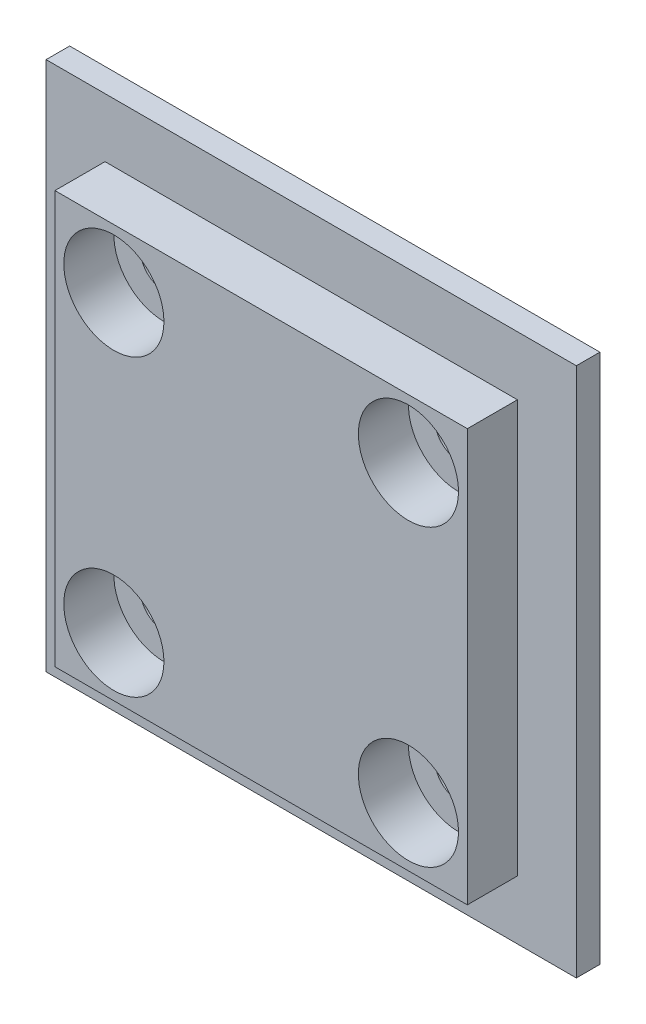
ISO-10303-21;
HEADER;
FILE_DESCRIPTION(('STEP AP214'),'2;1');
FILE_NAME('part.step','',(''),(''),'','','');
FILE_SCHEMA(('AUTOMOTIVE_DESIGN { 1 0 10303 214 1 1 1 1 }'));
ENDSEC;
DATA;
#1=APPLICATION_CONTEXT('core data for automotive mechanical design processes');
#2=APPLICATION_PROTOCOL_DEFINITION('international standard','automotive_design',2000,#1);
#3=PRODUCT_CONTEXT('',#1,'mechanical');
#4=PRODUCT('Part','Part','',(#3));
#5=PRODUCT_RELATED_PRODUCT_CATEGORY('part','',(#4));
#6=PRODUCT_DEFINITION_FORMATION('','',#4);
#7=PRODUCT_DEFINITION_CONTEXT('part definition',#1,'design');
#8=PRODUCT_DEFINITION('design','',#6,#7);
#9=PRODUCT_DEFINITION_SHAPE('','',#8);
#10=(LENGTH_UNIT() NAMED_UNIT(*) SI_UNIT(.MILLI.,.METRE.));
#11=(NAMED_UNIT(*) PLANE_ANGLE_UNIT() SI_UNIT($,.RADIAN.));
#12=(NAMED_UNIT(*) SI_UNIT($,.STERADIAN.) SOLID_ANGLE_UNIT());
#13=UNCERTAINTY_MEASURE_WITH_UNIT(LENGTH_MEASURE(1.E-05),#10,'distance_accuracy_value','');
#14=(GEOMETRIC_REPRESENTATION_CONTEXT(3) GLOBAL_UNCERTAINTY_ASSIGNED_CONTEXT((#13)) GLOBAL_UNIT_ASSIGNED_CONTEXT((#10,
#11,#12)) REPRESENTATION_CONTEXT('',''));
#15=CARTESIAN_POINT('',(0.,0.,0.));
#16=DIRECTION('',(0.,0.,1.));
#17=DIRECTION('',(1.,0.,0.));
#18=AXIS2_PLACEMENT_3D('',#15,#16,#17);
#19=CARTESIAN_POINT('',(10.,10.,4.));
#20=DIRECTION('',(0.,0.,-1.));
#21=DIRECTION('',(1.,0.,0.));
#22=AXIS2_PLACEMENT_3D('',#19,#20,#21);
#23=CYLINDRICAL_SURFACE('',#22,3.4);
#24=CARTESIAN_POINT('',(10.,10.,5.6));
#25=DIRECTION('',(0.,0.,-1.));
#26=DIRECTION('',(1.,0.,0.));
#27=AXIS2_PLACEMENT_3D('',#24,#25,#26);
#28=CIRCLE('',#27,3.4);
#29=CARTESIAN_POINT('',(13.4,10.,5.6));
#30=VERTEX_POINT('',#29);
#31=EDGE_CURVE('E206',#30,#30,#28,.T.);
#32=ORIENTED_EDGE('',*,*,#31,.T.);
#33=DIRECTION('',(0.,0.,1.));
#34=VECTOR('',#33,1.);
#35=CARTESIAN_POINT('',(13.4,10.,4.));
#36=LINE('',#35,#34);
#37=CARTESIAN_POINT('',(13.4,10.,9.));
#38=VERTEX_POINT('',#37);
#39=EDGE_CURVE('E9',#30,#38,#36,.T.);
#40=ORIENTED_EDGE('',*,*,#39,.T.);
#41=CARTESIAN_POINT('',(10.,10.,9.));
#42=DIRECTION('',(0.,0.,-1.));
#43=DIRECTION('',(1.,0.,0.));
#44=AXIS2_PLACEMENT_3D('',#41,#42,#43);
#45=CIRCLE('',#44,3.4);
#46=EDGE_CURVE('E238',#38,#38,#45,.T.);
#47=ORIENTED_EDGE('',*,*,#46,.F.);
#48=ORIENTED_EDGE('',*,*,#39,.F.);
#49=EDGE_LOOP('',(#32,#40,#47,#48));
#50=FACE_BOUND('',#49,.T.);
#51=ADVANCED_FACE('F15',(#50),#23,.F.);
#52=CARTESIAN_POINT('',(-10.,10.,4.));
#53=DIRECTION('',(0.,0.,-1.));
#54=DIRECTION('',(1.,0.,0.));
#55=AXIS2_PLACEMENT_3D('',#52,#53,#54);
#56=CYLINDRICAL_SURFACE('',#55,3.4);
#57=CARTESIAN_POINT('',(-10.,10.,5.6));
#58=DIRECTION('',(0.,0.,-1.));
#59=DIRECTION('',(1.,0.,0.));
#60=AXIS2_PLACEMENT_3D('',#57,#58,#59);
#61=CIRCLE('',#60,3.4);
#62=CARTESIAN_POINT('',(-6.6,10.,5.6));
#63=VERTEX_POINT('',#62);
#64=EDGE_CURVE('E209',#63,#63,#61,.T.);
#65=ORIENTED_EDGE('',*,*,#64,.T.);
#66=DIRECTION('',(0.,0.,1.));
#67=VECTOR('',#66,1.);
#68=CARTESIAN_POINT('',(-6.6,10.,4.));
#69=LINE('',#68,#67);
#70=CARTESIAN_POINT('',(-6.6,10.,9.));
#71=VERTEX_POINT('',#70);
#72=EDGE_CURVE('E18',#63,#71,#69,.T.);
#73=ORIENTED_EDGE('',*,*,#72,.T.);
#74=CARTESIAN_POINT('',(-10.,10.,9.));
#75=DIRECTION('',(0.,0.,-1.));
#76=DIRECTION('',(1.,0.,0.));
#77=AXIS2_PLACEMENT_3D('',#74,#75,#76);
#78=CIRCLE('',#77,3.4);
#79=EDGE_CURVE('E233',#71,#71,#78,.T.);
#80=ORIENTED_EDGE('',*,*,#79,.F.);
#81=ORIENTED_EDGE('',*,*,#72,.F.);
#82=EDGE_LOOP('',(#65,#73,#80,#81));
#83=FACE_BOUND('',#82,.T.);
#84=ADVANCED_FACE('F436',(#83),#56,.F.);
#85=CARTESIAN_POINT('',(10.,-10.,4.));
#86=DIRECTION('',(0.,0.,-1.));
#87=DIRECTION('',(1.,0.,0.));
#88=AXIS2_PLACEMENT_3D('',#85,#86,#87);
#89=CYLINDRICAL_SURFACE('',#88,3.4);
#90=CARTESIAN_POINT('',(10.,-10.,5.6));
#91=DIRECTION('',(0.,0.,-1.));
#92=DIRECTION('',(1.,0.,0.));
#93=AXIS2_PLACEMENT_3D('',#90,#91,#92);
#94=CIRCLE('',#93,3.4);
#95=CARTESIAN_POINT('',(13.4,-10.,5.6));
#96=VERTEX_POINT('',#95);
#97=EDGE_CURVE('E225',#96,#96,#94,.T.);
#98=ORIENTED_EDGE('',*,*,#97,.T.);
#99=DIRECTION('',(0.,0.,1.));
#100=VECTOR('',#99,1.);
#101=CARTESIAN_POINT('',(13.4,-10.,4.));
#102=LINE('',#101,#100);
#103=CARTESIAN_POINT('',(13.4,-10.,9.));
#104=VERTEX_POINT('',#103);
#105=EDGE_CURVE('E242',#96,#104,#102,.T.);
#106=ORIENTED_EDGE('',*,*,#105,.T.);
#107=CARTESIAN_POINT('',(10.,-10.,9.));
#108=DIRECTION('',(0.,0.,-1.));
#109=DIRECTION('',(1.,0.,0.));
#110=AXIS2_PLACEMENT_3D('',#107,#108,#109);
#111=CIRCLE('',#110,3.4);
#112=EDGE_CURVE('E232',#104,#104,#111,.T.);
#113=ORIENTED_EDGE('',*,*,#112,.F.);
#114=ORIENTED_EDGE('',*,*,#105,.F.);
#115=EDGE_LOOP('',(#98,#106,#113,#114));
#116=FACE_BOUND('',#115,.T.);
#117=ADVANCED_FACE('F430',(#116),#89,.F.);
#118=CARTESIAN_POINT('',(-10.,-10.,4.));
#119=DIRECTION('',(0.,0.,-1.));
#120=DIRECTION('',(1.,0.,0.));
#121=AXIS2_PLACEMENT_3D('',#118,#119,#120);
#122=CYLINDRICAL_SURFACE('',#121,3.4);
#123=CARTESIAN_POINT('',(-10.,-10.,5.6));
#124=DIRECTION('',(0.,0.,-1.));
#125=DIRECTION('',(1.,0.,0.));
#126=AXIS2_PLACEMENT_3D('',#123,#124,#125);
#127=CIRCLE('',#126,3.4);
#128=CARTESIAN_POINT('',(-6.6,-10.,5.6));
#129=VERTEX_POINT('',#128);
#130=EDGE_CURVE('E217',#129,#129,#127,.T.);
#131=ORIENTED_EDGE('',*,*,#130,.T.);
#132=DIRECTION('',(0.,0.,1.));
#133=VECTOR('',#132,1.);
#134=CARTESIAN_POINT('',(-6.6,-10.,4.));
#135=LINE('',#134,#133);
#136=CARTESIAN_POINT('',(-6.6,-10.,9.));
#137=VERTEX_POINT('',#136);
#138=EDGE_CURVE('E241',#129,#137,#135,.T.);
#139=ORIENTED_EDGE('',*,*,#138,.T.);
#140=CARTESIAN_POINT('',(-10.,-10.,9.));
#141=DIRECTION('',(0.,0.,-1.));
#142=DIRECTION('',(1.,0.,0.));
#143=AXIS2_PLACEMENT_3D('',#140,#141,#142);
#144=CIRCLE('',#143,3.4);
#145=EDGE_CURVE('E207',#137,#137,#144,.T.);
#146=ORIENTED_EDGE('',*,*,#145,.F.);
#147=ORIENTED_EDGE('',*,*,#138,.F.);
#148=EDGE_LOOP('',(#131,#139,#146,#147));
#149=FACE_BOUND('',#148,.T.);
#150=ADVANCED_FACE('F416',(#149),#122,.F.);
#151=CARTESIAN_POINT('',(0.,0.,9.));
#152=DIRECTION('',(0.,0.,1.));
#153=DIRECTION('',(1.,0.,0.));
#154=AXIS2_PLACEMENT_3D('',#151,#152,#153);
#155=PLANE('',#154);
#156=ORIENTED_EDGE('',*,*,#46,.T.);
#157=EDGE_LOOP('',(#156));
#158=FACE_BOUND('',#157,.T.);
#159=ORIENTED_EDGE('',*,*,#79,.T.);
#160=EDGE_LOOP('',(#159));
#161=FACE_BOUND('',#160,.T.);
#162=ORIENTED_EDGE('',*,*,#112,.T.);
#163=EDGE_LOOP('',(#162));
#164=FACE_BOUND('',#163,.T.);
#165=ORIENTED_EDGE('',*,*,#145,.T.);
#166=EDGE_LOOP('',(#165));
#167=FACE_BOUND('',#166,.T.);
#168=DIRECTION('',(1.,0.,0.));
#169=VECTOR('',#168,1.);
#170=CARTESIAN_POINT('',(-14.,-14.,9.));
#171=LINE('',#170,#169);
#172=CARTESIAN_POINT('',(-14.,-14.,9.));
#173=VERTEX_POINT('',#172);
#174=CARTESIAN_POINT('',(14.,-14.,9.));
#175=VERTEX_POINT('',#174);
#176=EDGE_CURVE('E196',#173,#175,#171,.T.);
#177=ORIENTED_EDGE('',*,*,#176,.T.);
#178=DIRECTION('',(0.,1.,0.));
#179=VECTOR('',#178,1.);
#180=CARTESIAN_POINT('',(14.,-14.,9.));
#181=LINE('',#180,#179);
#182=CARTESIAN_POINT('',(14.,14.,9.));
#183=VERTEX_POINT('',#182);
#184=EDGE_CURVE('E190',#175,#183,#181,.T.);
#185=ORIENTED_EDGE('',*,*,#184,.T.);
#186=DIRECTION('',(-1.,0.,0.));
#187=VECTOR('',#186,1.);
#188=CARTESIAN_POINT('',(14.,14.,9.));
#189=LINE('',#188,#187);
#190=CARTESIAN_POINT('',(-14.,14.,9.));
#191=VERTEX_POINT('',#190);
#192=EDGE_CURVE('E211',#183,#191,#189,.T.);
#193=ORIENTED_EDGE('',*,*,#192,.T.);
#194=DIRECTION('',(0.,-1.,0.));
#195=VECTOR('',#194,1.);
#196=CARTESIAN_POINT('',(-14.,14.,9.));
#197=LINE('',#196,#195);
#198=EDGE_CURVE('E214',#191,#173,#197,.T.);
#199=ORIENTED_EDGE('',*,*,#198,.T.);
#200=EDGE_LOOP('',(#177,#185,#193,#199));
#201=FACE_BOUND('',#200,.T.);
#202=ADVANCED_FACE('F408',(#158,#161,#164,#167,#201),#155,.T.);
#203=CARTESIAN_POINT('',(0.,0.,5.6));
#204=DIRECTION('',(0.,0.,1.));
#205=DIRECTION('',(1.,0.,0.));
#206=AXIS2_PLACEMENT_3D('',#203,#204,#205);
#207=PLANE('',#206);
#208=CARTESIAN_POINT('',(10.,10.,5.6));
#209=DIRECTION('',(0.,0.,-1.));
#210=DIRECTION('',(1.,0.,0.));
#211=AXIS2_PLACEMENT_3D('',#208,#209,#210);
#212=CIRCLE('',#211,1.6);
#213=CARTESIAN_POINT('',(11.6,10.,5.6));
#214=VERTEX_POINT('',#213);
#215=EDGE_CURVE('E176',#214,#214,#212,.T.);
#216=ORIENTED_EDGE('',*,*,#215,.T.);
#217=EDGE_LOOP('',(#216));
#218=FACE_BOUND('',#217,.T.);
#219=ORIENTED_EDGE('',*,*,#31,.F.);
#220=EDGE_LOOP('',(#219));
#221=FACE_BOUND('',#220,.T.);
#222=ADVANCED_FACE('F405',(#218,#221),#207,.T.);
#223=CARTESIAN_POINT('',(0.,0.,5.6));
#224=DIRECTION('',(0.,0.,1.));
#225=DIRECTION('',(1.,0.,0.));
#226=AXIS2_PLACEMENT_3D('',#223,#224,#225);
#227=PLANE('',#226);
#228=CARTESIAN_POINT('',(-10.,10.,5.6));
#229=DIRECTION('',(0.,0.,-1.));
#230=DIRECTION('',(1.,0.,0.));
#231=AXIS2_PLACEMENT_3D('',#228,#229,#230);
#232=CIRCLE('',#231,1.6);
#233=CARTESIAN_POINT('',(-8.4,10.,5.6));
#234=VERTEX_POINT('',#233);
#235=EDGE_CURVE('E164',#234,#234,#232,.T.);
#236=ORIENTED_EDGE('',*,*,#235,.T.);
#237=EDGE_LOOP('',(#236));
#238=FACE_BOUND('',#237,.T.);
#239=ORIENTED_EDGE('',*,*,#64,.F.);
#240=EDGE_LOOP('',(#239));
#241=FACE_BOUND('',#240,.T.);
#242=ADVANCED_FACE('F167',(#238,#241),#227,.T.);
#243=CARTESIAN_POINT('',(0.,0.,5.6));
#244=DIRECTION('',(0.,0.,1.));
#245=DIRECTION('',(1.,0.,0.));
#246=AXIS2_PLACEMENT_3D('',#243,#244,#245);
#247=PLANE('',#246);
#248=CARTESIAN_POINT('',(10.,-10.,5.6));
#249=DIRECTION('',(0.,0.,-1.));
#250=DIRECTION('',(1.,0.,0.));
#251=AXIS2_PLACEMENT_3D('',#248,#249,#250);
#252=CIRCLE('',#251,1.6);
#253=CARTESIAN_POINT('',(11.6,-10.,5.6));
#254=VERTEX_POINT('',#253);
#255=EDGE_CURVE('E181',#254,#254,#252,.T.);
#256=ORIENTED_EDGE('',*,*,#255,.T.);
#257=EDGE_LOOP('',(#256));
#258=FACE_BOUND('',#257,.T.);
#259=ORIENTED_EDGE('',*,*,#97,.F.);
#260=EDGE_LOOP('',(#259));
#261=FACE_BOUND('',#260,.T.);
#262=ADVANCED_FACE('F316',(#258,#261),#247,.T.);
#263=CARTESIAN_POINT('',(0.,0.,5.6));
#264=DIRECTION('',(0.,0.,1.));
#265=DIRECTION('',(1.,0.,0.));
#266=AXIS2_PLACEMENT_3D('',#263,#264,#265);
#267=PLANE('',#266);
#268=CARTESIAN_POINT('',(-10.,-10.,5.6));
#269=DIRECTION('',(0.,0.,-1.));
#270=DIRECTION('',(1.,0.,0.));
#271=AXIS2_PLACEMENT_3D('',#268,#269,#270);
#272=CIRCLE('',#271,1.6);
#273=CARTESIAN_POINT('',(-8.4,-10.,5.6));
#274=VERTEX_POINT('',#273);
#275=EDGE_CURVE('E507',#274,#274,#272,.T.);
#276=ORIENTED_EDGE('',*,*,#275,.T.);
#277=EDGE_LOOP('',(#276));
#278=FACE_BOUND('',#277,.T.);
#279=ORIENTED_EDGE('',*,*,#130,.F.);
#280=EDGE_LOOP('',(#279));
#281=FACE_BOUND('',#280,.T.);
#282=ADVANCED_FACE('F283',(#278,#281),#267,.T.);
#283=CARTESIAN_POINT('',(-14.,14.,5.6));
#284=DIRECTION('',(1.,0.,0.));
#285=DIRECTION('',(0.,1.,0.));
#286=AXIS2_PLACEMENT_3D('',#283,#284,#285);
#287=PLANE('',#286);
#288=DIRECTION('',(0.,-1.,0.));
#289=VECTOR('',#288,1.);
#290=CARTESIAN_POINT('',(-14.,14.,5.6));
#291=LINE('',#290,#289);
#292=CARTESIAN_POINT('',(-14.,14.,5.6));
#293=VERTEX_POINT('',#292);
#294=CARTESIAN_POINT('',(-14.,-14.,5.6));
#295=VERTEX_POINT('',#294);
#296=EDGE_CURVE('E506',#293,#295,#291,.T.);
#297=ORIENTED_EDGE('',*,*,#296,.T.);
#298=DIRECTION('',(0.,0.,1.));
#299=VECTOR('',#298,1.);
#300=CARTESIAN_POINT('',(-14.,-14.,5.6));
#301=LINE('',#300,#299);
#302=EDGE_CURVE('E205',#295,#173,#301,.T.);
#303=ORIENTED_EDGE('',*,*,#302,.T.);
#304=ORIENTED_EDGE('',*,*,#198,.F.);
#305=DIRECTION('',(0.,0.,1.));
#306=VECTOR('',#305,1.);
#307=CARTESIAN_POINT('',(-14.,14.,5.6));
#308=LINE('',#307,#306);
#309=EDGE_CURVE('E188',#293,#191,#308,.T.);
#310=ORIENTED_EDGE('',*,*,#309,.F.);
#311=EDGE_LOOP('',(#297,#303,#304,#310));
#312=FACE_BOUND('',#311,.T.);
#313=ADVANCED_FACE('F279',(#312),#287,.F.);
#314=CARTESIAN_POINT('',(14.,14.,5.6));
#315=DIRECTION('',(0.,-1.,0.));
#316=DIRECTION('',(0.,0.,-1.));
#317=AXIS2_PLACEMENT_3D('',#314,#315,#316);
#318=PLANE('',#317);
#319=DIRECTION('',(-1.,0.,0.));
#320=VECTOR('',#319,1.);
#321=CARTESIAN_POINT('',(14.,14.,5.6));
#322=LINE('',#321,#320);
#323=CARTESIAN_POINT('',(14.,14.,5.6));
#324=VERTEX_POINT('',#323);
#325=EDGE_CURVE('E500',#324,#293,#322,.T.);
#326=ORIENTED_EDGE('',*,*,#325,.T.);
#327=ORIENTED_EDGE('',*,*,#309,.T.);
#328=ORIENTED_EDGE('',*,*,#192,.F.);
#329=DIRECTION('',(0.,0.,1.));
#330=VECTOR('',#329,1.);
#331=CARTESIAN_POINT('',(14.,14.,5.6));
#332=LINE('',#331,#330);
#333=EDGE_CURVE('E189',#324,#183,#332,.T.);
#334=ORIENTED_EDGE('',*,*,#333,.F.);
#335=EDGE_LOOP('',(#326,#327,#328,#334));
#336=FACE_BOUND('',#335,.T.);
#337=ADVANCED_FACE('F284',(#336),#318,.F.);
#338=CARTESIAN_POINT('',(14.,-14.,5.6));
#339=DIRECTION('',(-1.,0.,0.));
#340=DIRECTION('',(0.,0.,1.));
#341=AXIS2_PLACEMENT_3D('',#338,#339,#340);
#342=PLANE('',#341);
#343=DIRECTION('',(0.,1.,0.));
#344=VECTOR('',#343,1.);
#345=CARTESIAN_POINT('',(14.,-14.,5.6));
#346=LINE('',#345,#344);
#347=CARTESIAN_POINT('',(14.,-14.,5.6));
#348=VERTEX_POINT('',#347);
#349=EDGE_CURVE('E495',#348,#324,#346,.T.);
#350=ORIENTED_EDGE('',*,*,#349,.T.);
#351=ORIENTED_EDGE('',*,*,#333,.T.);
#352=ORIENTED_EDGE('',*,*,#184,.F.);
#353=DIRECTION('',(0.,0.,1.));
#354=VECTOR('',#353,1.);
#355=CARTESIAN_POINT('',(14.,-14.,5.6));
#356=LINE('',#355,#354);
#357=EDGE_CURVE('E192',#348,#175,#356,.T.);
#358=ORIENTED_EDGE('',*,*,#357,.F.);
#359=EDGE_LOOP('',(#350,#351,#352,#358));
#360=FACE_BOUND('',#359,.T.);
#361=ADVANCED_FACE('F378',(#360),#342,.F.);
#362=CARTESIAN_POINT('',(-14.,-14.,5.6));
#363=DIRECTION('',(0.,1.,0.));
#364=DIRECTION('',(1.,0.,0.));
#365=AXIS2_PLACEMENT_3D('',#362,#363,#364);
#366=PLANE('',#365);
#367=DIRECTION('',(1.,0.,0.));
#368=VECTOR('',#367,1.);
#369=CARTESIAN_POINT('',(-14.,-14.,5.6));
#370=LINE('',#369,#368);
#371=EDGE_CURVE('E487',#295,#348,#370,.T.);
#372=ORIENTED_EDGE('',*,*,#371,.T.);
#373=ORIENTED_EDGE('',*,*,#357,.T.);
#374=ORIENTED_EDGE('',*,*,#176,.F.);
#375=ORIENTED_EDGE('',*,*,#302,.F.);
#376=EDGE_LOOP('',(#372,#373,#374,#375));
#377=FACE_BOUND('',#376,.T.);
#378=ADVANCED_FACE('F369',(#377),#366,.F.);
#379=CARTESIAN_POINT('',(10.,10.,3.));
#380=DIRECTION('',(0.,0.,-1.));
#381=DIRECTION('',(1.,0.,0.));
#382=AXIS2_PLACEMENT_3D('',#379,#380,#381);
#383=CYLINDRICAL_SURFACE('',#382,1.6);
#384=CARTESIAN_POINT('',(10.,10.,4.));
#385=DIRECTION('',(0.,0.,-1.));
#386=DIRECTION('',(1.,0.,0.));
#387=AXIS2_PLACEMENT_3D('',#384,#385,#386);
#388=CIRCLE('',#387,1.6);
#389=CARTESIAN_POINT('',(11.6,10.,4.));
#390=VERTEX_POINT('',#389);
#391=EDGE_CURVE('E533',#390,#390,#388,.T.);
#392=ORIENTED_EDGE('',*,*,#391,.T.);
#393=DIRECTION('',(0.,0.,1.));
#394=VECTOR('',#393,1.);
#395=CARTESIAN_POINT('',(11.6,10.,3.));
#396=LINE('',#395,#394);
#397=EDGE_CURVE('E171',#390,#214,#396,.T.);
#398=ORIENTED_EDGE('',*,*,#397,.T.);
#399=ORIENTED_EDGE('',*,*,#215,.F.);
#400=ORIENTED_EDGE('',*,*,#397,.F.);
#401=EDGE_LOOP('',(#392,#398,#399,#400));
#402=FACE_BOUND('',#401,.T.);
#403=ADVANCED_FACE('F363',(#402),#383,.F.);
#404=CARTESIAN_POINT('',(-10.,10.,3.));
#405=DIRECTION('',(0.,0.,-1.));
#406=DIRECTION('',(1.,0.,0.));
#407=AXIS2_PLACEMENT_3D('',#404,#405,#406);
#408=CYLINDRICAL_SURFACE('',#407,1.6);
#409=CARTESIAN_POINT('',(-10.,10.,4.));
#410=DIRECTION('',(0.,0.,-1.));
#411=DIRECTION('',(1.,0.,0.));
#412=AXIS2_PLACEMENT_3D('',#409,#410,#411);
#413=CIRCLE('',#412,1.6);
#414=CARTESIAN_POINT('',(-8.4,10.,4.));
#415=VERTEX_POINT('',#414);
#416=EDGE_CURVE('E524',#415,#415,#413,.T.);
#417=ORIENTED_EDGE('',*,*,#416,.T.);
#418=DIRECTION('',(0.,0.,1.));
#419=VECTOR('',#418,1.);
#420=CARTESIAN_POINT('',(-8.4,10.,3.));
#421=LINE('',#420,#419);
#422=EDGE_CURVE('E172',#415,#234,#421,.T.);
#423=ORIENTED_EDGE('',*,*,#422,.T.);
#424=ORIENTED_EDGE('',*,*,#235,.F.);
#425=ORIENTED_EDGE('',*,*,#422,.F.);
#426=EDGE_LOOP('',(#417,#423,#424,#425));
#427=FACE_BOUND('',#426,.T.);
#428=ADVANCED_FACE('F355',(#427),#408,.F.);
#429=CARTESIAN_POINT('',(10.,-10.,3.));
#430=DIRECTION('',(0.,0.,-1.));
#431=DIRECTION('',(1.,0.,0.));
#432=AXIS2_PLACEMENT_3D('',#429,#430,#431);
#433=CYLINDRICAL_SURFACE('',#432,1.6);
#434=CARTESIAN_POINT('',(10.,-10.,4.));
#435=DIRECTION('',(0.,0.,-1.));
#436=DIRECTION('',(1.,0.,0.));
#437=AXIS2_PLACEMENT_3D('',#434,#435,#436);
#438=CIRCLE('',#437,1.6);
#439=CARTESIAN_POINT('',(11.6,-10.,4.));
#440=VERTEX_POINT('',#439);
#441=EDGE_CURVE('E525',#440,#440,#438,.T.);
#442=ORIENTED_EDGE('',*,*,#441,.T.);
#443=DIRECTION('',(0.,0.,1.));
#444=VECTOR('',#443,1.);
#445=CARTESIAN_POINT('',(11.6,-10.,3.));
#446=LINE('',#445,#444);
#447=EDGE_CURVE('E513',#440,#254,#446,.T.);
#448=ORIENTED_EDGE('',*,*,#447,.T.);
#449=ORIENTED_EDGE('',*,*,#255,.F.);
#450=ORIENTED_EDGE('',*,*,#447,.F.);
#451=EDGE_LOOP('',(#442,#448,#449,#450));
#452=FACE_BOUND('',#451,.T.);
#453=ADVANCED_FACE('F336',(#452),#433,.F.);
#454=CARTESIAN_POINT('',(-10.,-10.,3.));
#455=DIRECTION('',(0.,0.,-1.));
#456=DIRECTION('',(1.,0.,0.));
#457=AXIS2_PLACEMENT_3D('',#454,#455,#456);
#458=CYLINDRICAL_SURFACE('',#457,1.6);
#459=CARTESIAN_POINT('',(-10.,-10.,4.));
#460=DIRECTION('',(0.,0.,-1.));
#461=DIRECTION('',(1.,0.,0.));
#462=AXIS2_PLACEMENT_3D('',#459,#460,#461);
#463=CIRCLE('',#462,1.6);
#464=CARTESIAN_POINT('',(-8.4,-10.,4.));
#465=VERTEX_POINT('',#464);
#466=EDGE_CURVE('E528',#465,#465,#463,.T.);
#467=ORIENTED_EDGE('',*,*,#466,.T.);
#468=DIRECTION('',(0.,0.,1.));
#469=VECTOR('',#468,1.);
#470=CARTESIAN_POINT('',(-8.4,-10.,3.));
#471=LINE('',#470,#469);
#472=EDGE_CURVE('E496',#465,#274,#471,.T.);
#473=ORIENTED_EDGE('',*,*,#472,.T.);
#474=ORIENTED_EDGE('',*,*,#275,.F.);
#475=ORIENTED_EDGE('',*,*,#472,.F.);
#476=EDGE_LOOP('',(#467,#473,#474,#475));
#477=FACE_BOUND('',#476,.T.);
#478=ADVANCED_FACE('F296',(#477),#458,.F.);
#479=CARTESIAN_POINT('',(18.,18.,4.));
#480=DIRECTION('',(0.,-1.,0.));
#481=DIRECTION('',(0.,0.,-1.));
#482=AXIS2_PLACEMENT_3D('',#479,#480,#481);
#483=PLANE('',#482);
#484=DIRECTION('',(-1.,0.,0.));
#485=VECTOR('',#484,1.);
#486=CARTESIAN_POINT('',(18.,18.,4.));
#487=LINE('',#486,#485);
#488=CARTESIAN_POINT('',(18.,18.,4.));
#489=VERTEX_POINT('',#488);
#490=CARTESIAN_POINT('',(-18.,18.,4.));
#491=VERTEX_POINT('',#490);
#492=EDGE_CURVE('E532',#489,#491,#487,.T.);
#493=ORIENTED_EDGE('',*,*,#492,.T.);
#494=DIRECTION('',(0.,0.,1.));
#495=VECTOR('',#494,1.);
#496=CARTESIAN_POINT('',(-18.,18.,4.));
#497=LINE('',#496,#495);
#498=CARTESIAN_POINT('',(-18.,18.,5.6));
#499=VERTEX_POINT('',#498);
#500=EDGE_CURVE('E569',#491,#499,#497,.T.);
#501=ORIENTED_EDGE('',*,*,#500,.T.);
#502=DIRECTION('',(-1.,0.,0.));
#503=VECTOR('',#502,1.);
#504=CARTESIAN_POINT('',(18.,18.,5.6));
#505=LINE('',#504,#503);
#506=CARTESIAN_POINT('',(18.,18.,5.6));
#507=VERTEX_POINT('',#506);
#508=EDGE_CURVE('E545',#507,#499,#505,.T.);
#509=ORIENTED_EDGE('',*,*,#508,.F.);
#510=DIRECTION('',(0.,0.,1.));
#511=VECTOR('',#510,1.);
#512=CARTESIAN_POINT('',(18.,18.,4.));
#513=LINE('',#512,#511);
#514=EDGE_CURVE('E577',#489,#507,#513,.T.);
#515=ORIENTED_EDGE('',*,*,#514,.F.);
#516=EDGE_LOOP('',(#493,#501,#509,#515));
#517=FACE_BOUND('',#516,.T.);
#518=ADVANCED_FACE('F295',(#517),#483,.F.);
#519=CARTESIAN_POINT('',(0.,0.,5.6));
#520=DIRECTION('',(0.,0.,1.));
#521=DIRECTION('',(1.,0.,0.));
#522=AXIS2_PLACEMENT_3D('',#519,#520,#521);
#523=PLANE('',#522);
#524=ORIENTED_EDGE('',*,*,#371,.F.);
#525=ORIENTED_EDGE('',*,*,#296,.F.);
#526=ORIENTED_EDGE('',*,*,#325,.F.);
#527=ORIENTED_EDGE('',*,*,#349,.F.);
#528=EDGE_LOOP('',(#524,#525,#526,#527));
#529=FACE_BOUND('',#528,.T.);
#530=DIRECTION('',(1.,0.,0.));
#531=VECTOR('',#530,1.);
#532=CARTESIAN_POINT('',(-18.,-18.,5.6));
#533=LINE('',#532,#531);
#534=CARTESIAN_POINT('',(-18.,-18.,5.6));
#535=VERTEX_POINT('',#534);
#536=CARTESIAN_POINT('',(18.,-18.,5.6));
#537=VERTEX_POINT('',#536);
#538=EDGE_CURVE('E598',#535,#537,#533,.T.);
#539=ORIENTED_EDGE('',*,*,#538,.T.);
#540=DIRECTION('',(0.,1.,0.));
#541=VECTOR('',#540,1.);
#542=CARTESIAN_POINT('',(18.,-18.,5.6));
#543=LINE('',#542,#541);
#544=EDGE_CURVE('E572',#537,#507,#543,.T.);
#545=ORIENTED_EDGE('',*,*,#544,.T.);
#546=ORIENTED_EDGE('',*,*,#508,.T.);
#547=DIRECTION('',(0.,-1.,0.));
#548=VECTOR('',#547,1.);
#549=CARTESIAN_POINT('',(-18.,18.,5.6));
#550=LINE('',#549,#548);
#551=EDGE_CURVE('E568',#499,#535,#550,.T.);
#552=ORIENTED_EDGE('',*,*,#551,.T.);
#553=EDGE_LOOP('',(#539,#545,#546,#552));
#554=FACE_BOUND('',#553,.T.);
#555=ADVANCED_FACE('F259',(#529,#554),#523,.T.);
#556=CARTESIAN_POINT('',(0.,0.,4.));
#557=DIRECTION('',(0.,0.,1.));
#558=DIRECTION('',(1.,0.,0.));
#559=AXIS2_PLACEMENT_3D('',#556,#557,#558);
#560=PLANE('',#559);
#561=ORIENTED_EDGE('',*,*,#391,.F.);
#562=EDGE_LOOP('',(#561));
#563=FACE_BOUND('',#562,.T.);
#564=ORIENTED_EDGE('',*,*,#416,.F.);
#565=EDGE_LOOP('',(#564));
#566=FACE_BOUND('',#565,.T.);
#567=ORIENTED_EDGE('',*,*,#441,.F.);
#568=EDGE_LOOP('',(#567));
#569=FACE_BOUND('',#568,.T.);
#570=ORIENTED_EDGE('',*,*,#466,.F.);
#571=EDGE_LOOP('',(#570));
#572=FACE_BOUND('',#571,.T.);
#573=DIRECTION('',(0.,-1.,0.));
#574=VECTOR('',#573,1.);
#575=CARTESIAN_POINT('',(-18.,18.,4.));
#576=LINE('',#575,#574);
#577=CARTESIAN_POINT('',(-18.,-18.,4.));
#578=VERTEX_POINT('',#577);
#579=EDGE_CURVE('E570',#491,#578,#576,.T.);
#580=ORIENTED_EDGE('',*,*,#579,.F.);
#581=ORIENTED_EDGE('',*,*,#492,.F.);
#582=DIRECTION('',(0.,1.,0.));
#583=VECTOR('',#582,1.);
#584=CARTESIAN_POINT('',(18.,-18.,4.));
#585=LINE('',#584,#583);
#586=CARTESIAN_POINT('',(18.,-18.,4.));
#587=VERTEX_POINT('',#586);
#588=EDGE_CURVE('E574',#587,#489,#585,.T.);
#589=ORIENTED_EDGE('',*,*,#588,.F.);
#590=DIRECTION('',(1.,0.,0.));
#591=VECTOR('',#590,1.);
#592=CARTESIAN_POINT('',(-18.,-18.,4.));
#593=LINE('',#592,#591);
#594=EDGE_CURVE('E589',#578,#587,#593,.T.);
#595=ORIENTED_EDGE('',*,*,#594,.F.);
#596=EDGE_LOOP('',(#580,#581,#589,#595));
#597=FACE_BOUND('',#596,.T.);
#598=ADVANCED_FACE('F251',(#563,#566,#569,#572,#597),#560,.F.);
#599=CARTESIAN_POINT('',(18.,-18.,4.));
#600=DIRECTION('',(-1.,0.,0.));
#601=DIRECTION('',(0.,0.,1.));
#602=AXIS2_PLACEMENT_3D('',#599,#600,#601);
#603=PLANE('',#602);
#604=ORIENTED_EDGE('',*,*,#588,.T.);
#605=ORIENTED_EDGE('',*,*,#514,.T.);
#606=ORIENTED_EDGE('',*,*,#544,.F.);
#607=DIRECTION('',(0.,0.,1.));
#608=VECTOR('',#607,1.);
#609=CARTESIAN_POINT('',(18.,-18.,4.));
#610=LINE('',#609,#608);
#611=EDGE_CURVE('E593',#587,#537,#610,.T.);
#612=ORIENTED_EDGE('',*,*,#611,.F.);
#613=EDGE_LOOP('',(#604,#605,#606,#612));
#614=FACE_BOUND('',#613,.T.);
#615=ADVANCED_FACE('F256',(#614),#603,.F.);
#616=CARTESIAN_POINT('',(-18.,18.,4.));
#617=DIRECTION('',(1.,0.,0.));
#618=DIRECTION('',(0.,1.,0.));
#619=AXIS2_PLACEMENT_3D('',#616,#617,#618);
#620=PLANE('',#619);
#621=ORIENTED_EDGE('',*,*,#579,.T.);
#622=DIRECTION('',(0.,0.,1.));
#623=VECTOR('',#622,1.);
#624=CARTESIAN_POINT('',(-18.,-18.,4.));
#625=LINE('',#624,#623);
#626=EDGE_CURVE('E592',#578,#535,#625,.T.);
#627=ORIENTED_EDGE('',*,*,#626,.T.);
#628=ORIENTED_EDGE('',*,*,#551,.F.);
#629=ORIENTED_EDGE('',*,*,#500,.F.);
#630=EDGE_LOOP('',(#621,#627,#628,#629));
#631=FACE_BOUND('',#630,.T.);
#632=ADVANCED_FACE('F275',(#631),#620,.F.);
#633=CARTESIAN_POINT('',(-18.,-18.,4.));
#634=DIRECTION('',(0.,1.,0.));
#635=DIRECTION('',(1.,0.,0.));
#636=AXIS2_PLACEMENT_3D('',#633,#634,#635);
#637=PLANE('',#636);
#638=ORIENTED_EDGE('',*,*,#594,.T.);
#639=ORIENTED_EDGE('',*,*,#611,.T.);
#640=ORIENTED_EDGE('',*,*,#538,.F.);
#641=ORIENTED_EDGE('',*,*,#626,.F.);
#642=EDGE_LOOP('',(#638,#639,#640,#641));
#643=FACE_BOUND('',#642,.T.);
#644=ADVANCED_FACE('F270',(#643),#637,.F.);
#645=CLOSED_SHELL('',(#51,#84,#117,#150,#202,#222,#242,#262,#282,#313,#337,#361,#378,#403,#428,
#453,#478,#518,#555,#598,#615,#632,#644));
#646=MANIFOLD_SOLID_BREP('B1',#645);
#647=ADVANCED_BREP_SHAPE_REPRESENTATION('',(#18,#646),#14);
#648=SHAPE_DEFINITION_REPRESENTATION(#9,#647);
ENDSEC;
END-ISO-10303-21;
